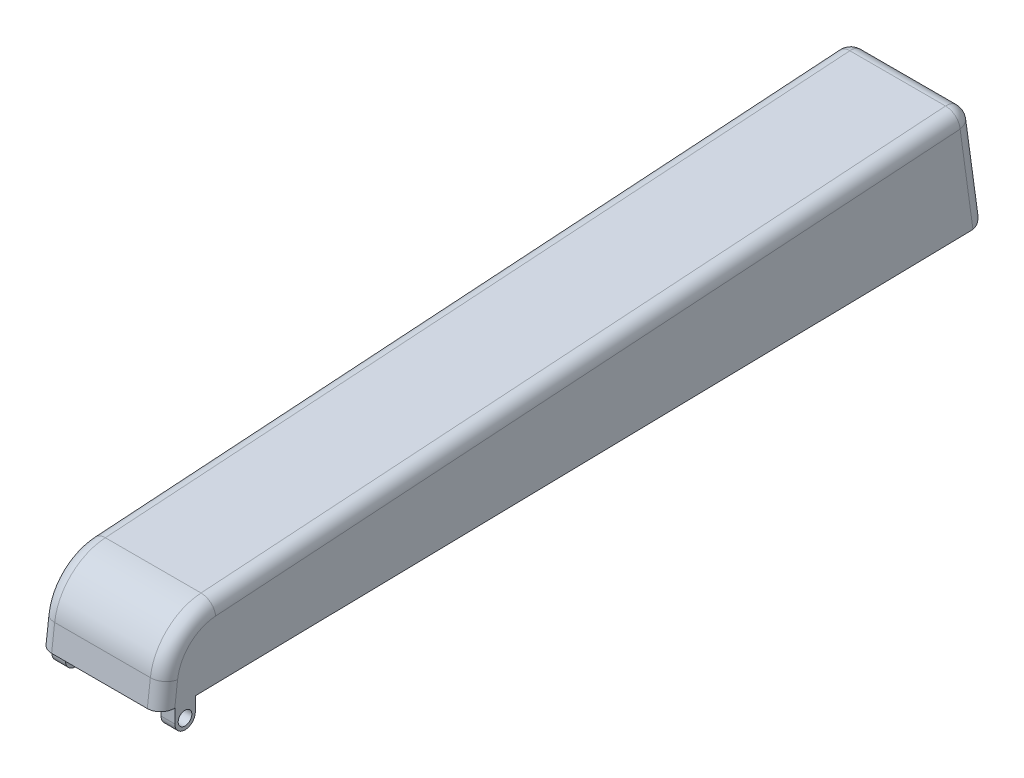
ISO-10303-21;
HEADER;
FILE_DESCRIPTION(('STEP AP214'),'2;1');
FILE_NAME('part.step','',(''),(''),'','','');
FILE_SCHEMA(('AUTOMOTIVE_DESIGN { 1 0 10303 214 1 1 1 1 }'));
ENDSEC;
DATA;
#1=APPLICATION_CONTEXT('core data for automotive mechanical design processes');
#2=APPLICATION_PROTOCOL_DEFINITION('international standard','automotive_design',2000,#1);
#3=PRODUCT_CONTEXT('',#1,'mechanical');
#4=PRODUCT('Part','Part','',(#3));
#5=PRODUCT_RELATED_PRODUCT_CATEGORY('part','',(#4));
#6=PRODUCT_DEFINITION_FORMATION('','',#4);
#7=PRODUCT_DEFINITION_CONTEXT('part definition',#1,'design');
#8=PRODUCT_DEFINITION('design','',#6,#7);
#9=PRODUCT_DEFINITION_SHAPE('','',#8);
#10=(LENGTH_UNIT() NAMED_UNIT(*) SI_UNIT(.MILLI.,.METRE.));
#11=(NAMED_UNIT(*) PLANE_ANGLE_UNIT() SI_UNIT($,.RADIAN.));
#12=(NAMED_UNIT(*) SI_UNIT($,.STERADIAN.) SOLID_ANGLE_UNIT());
#13=UNCERTAINTY_MEASURE_WITH_UNIT(LENGTH_MEASURE(1.E-05),#10,'distance_accuracy_value','');
#14=(GEOMETRIC_REPRESENTATION_CONTEXT(3) GLOBAL_UNCERTAINTY_ASSIGNED_CONTEXT((#13)) GLOBAL_UNIT_ASSIGNED_CONTEXT((#10,
#11,#12)) REPRESENTATION_CONTEXT('',''));
#15=CARTESIAN_POINT('',(0.,0.,0.));
#16=DIRECTION('',(0.,0.,1.));
#17=DIRECTION('',(1.,0.,0.));
#18=AXIS2_PLACEMENT_3D('',#15,#16,#17);
#19=CARTESIAN_POINT('',(22.8600000000001,-6.59720183053403,95.3996827995972));
#20=DIRECTION('',(0.,0.999811154580376,0.0194333521724517));
#21=DIRECTION('',(0.,-0.0194333521724517,0.999811154580376));
#22=AXIS2_PLACEMENT_3D('',#19,#20,#21);
#23=PLANE('',#22);
#24=DIRECTION('',(0.,0.0194333521724517,-0.999811154580376));
#25=VECTOR('',#24,1.);
#26=CARTESIAN_POINT('',(0.,-6.59720183053403,95.3996827995972));
#27=LINE('',#26,#25);
#28=CARTESIAN_POINT('',(0.,-6.473302977134,89.0253087559675));
#29=VERTEX_POINT('',#28);
#30=CARTESIAN_POINT('',(0.,-3.67064326639599,-55.1665124194799));
#31=VERTEX_POINT('',#30);
#32=EDGE_CURVE('E390',#29,#31,#27,.T.);
#33=ORIENTED_EDGE('',*,*,#32,.T.);
#34=DIRECTION('',(-1.,0.,0.));
#35=VECTOR('',#34,1.);
#36=CARTESIAN_POINT('',(22.8600000000001,-3.67064326639599,-55.1665124194799));
#37=LINE('',#36,#35);
#38=CARTESIAN_POINT('',(2.53999999999999,-3.67064326639599,-55.16651241948));
#39=VERTEX_POINT('',#38);
#40=EDGE_CURVE('E452',#31,#39,#37,.F.);
#41=ORIENTED_EDGE('',*,*,#40,.T.);
#42=DIRECTION('',(0.,0.0194333521724517,-0.999811154580376));
#43=VECTOR('',#42,1.);
#44=CARTESIAN_POINT('',(2.53999999999999,-6.59720183053403,95.3996827995972));
#45=LINE('',#44,#43);
#46=CARTESIAN_POINT('',(2.53999999999999,-6.473302977134,89.0253087559675));
#47=VERTEX_POINT('',#46);
#48=EDGE_CURVE('E361',#47,#39,#45,.T.);
#49=ORIENTED_EDGE('',*,*,#48,.F.);
#50=DIRECTION('',(-1.,0.,0.));
#51=VECTOR('',#50,1.);
#52=CARTESIAN_POINT('',(2.53999999999999,-6.473302977134,89.0253087559675));
#53=LINE('',#52,#51);
#54=EDGE_CURVE('E298',#47,#29,#53,.T.);
#55=ORIENTED_EDGE('',*,*,#54,.T.);
#56=EDGE_LOOP('',(#33,#41,#49,#55));
#57=FACE_BOUND('',#56,.T.);
#58=ADVANCED_FACE('F129',(#57),#23,.F.);
#59=DIRECTION('',(0.,0.0194333521724517,-0.999811154580376));
#60=VECTOR('',#59,1.);
#61=CARTESIAN_POINT('',(20.3199999999999,-6.59720183053403,95.3996827995972));
#62=LINE('',#61,#60);
#63=CARTESIAN_POINT('',(20.3199999999999,-6.473302977134,89.0253087559675));
#64=VERTEX_POINT('',#63);
#65=CARTESIAN_POINT('',(20.3199999999999,-3.67064326639599,-55.16651241948));
#66=VERTEX_POINT('',#65);
#67=EDGE_CURVE('E365',#64,#66,#62,.T.);
#68=ORIENTED_EDGE('',*,*,#67,.T.);
#69=DIRECTION('',(-1.,0.,0.));
#70=VECTOR('',#69,1.);
#71=CARTESIAN_POINT('',(22.8600000000001,-3.67064326639599,-55.1665124194799));
#72=LINE('',#71,#70);
#73=CARTESIAN_POINT('',(22.8600000000001,-3.67064326639599,-55.1665124194799));
#74=VERTEX_POINT('',#73);
#75=EDGE_CURVE('E450',#66,#74,#72,.F.);
#76=ORIENTED_EDGE('',*,*,#75,.T.);
#77=DIRECTION('',(0.,0.0194333521724517,-0.999811154580376));
#78=VECTOR('',#77,1.);
#79=CARTESIAN_POINT('',(22.8600000000001,-6.59720183053403,95.3996827995972));
#80=LINE('',#79,#78);
#81=CARTESIAN_POINT('',(22.8600000000001,-6.473302977134,89.0253087559675));
#82=VERTEX_POINT('',#81);
#83=EDGE_CURVE('E394',#82,#74,#80,.T.);
#84=ORIENTED_EDGE('',*,*,#83,.F.);
#85=DIRECTION('',(1.,0.,0.));
#86=VECTOR('',#85,1.);
#87=CARTESIAN_POINT('',(20.3199999999999,-6.473302977134,89.0253087559675));
#88=LINE('',#87,#86);
#89=EDGE_CURVE('E347',#64,#82,#88,.T.);
#90=ORIENTED_EDGE('',*,*,#89,.F.);
#91=EDGE_LOOP('',(#68,#76,#84,#90));
#92=FACE_BOUND('',#91,.T.);
#93=ADVANCED_FACE('F537',(#92),#23,.F.);
#94=DIRECTION('',(1.,0.,0.));
#95=VECTOR('',#94,1.);
#96=CARTESIAN_POINT('',(20.3199999999999,-6.5473580338693,92.8353087559676));
#97=LINE('',#96,#95);
#98=CARTESIAN_POINT('',(20.3199999999999,-6.5473580338693,92.8353087559676));
#99=VERTEX_POINT('',#98);
#100=CARTESIAN_POINT('',(22.8600000000001,-6.5473580338693,92.8353087559676));
#101=VERTEX_POINT('',#100);
#102=EDGE_CURVE('E344',#99,#101,#97,.T.);
#103=ORIENTED_EDGE('',*,*,#102,.T.);
#104=CARTESIAN_POINT('',(20.3199999999999,-6.5473580338693,92.8353087559676));
#105=DIRECTION('',(0.,0.999811154580376,0.0194333521724517));
#106=DIRECTION('',(0.,0.0194333521724517,-0.999811154580376));
#107=AXIS2_PLACEMENT_3D('',#104,#105,#106);
#108=ELLIPSE('',#107,2.5648584053917,2.54);
#109=CARTESIAN_POINT('',(20.3199999999999,-6.59720183053403,95.3996827995972));
#110=VERTEX_POINT('',#109);
#111=EDGE_CURVE('E421',#101,#110,#108,.F.);
#112=ORIENTED_EDGE('',*,*,#111,.T.);
#113=DIRECTION('',(-1.,0.,0.));
#114=VECTOR('',#113,1.);
#115=CARTESIAN_POINT('',(22.8600000000001,-6.59720183053403,95.3996827995972));
#116=LINE('',#115,#114);
#117=CARTESIAN_POINT('',(2.53999999999999,-6.59720183053403,95.3996827995972));
#118=VERTEX_POINT('',#117);
#119=EDGE_CURVE('E405',#110,#118,#116,.T.);
#120=ORIENTED_EDGE('',*,*,#119,.T.);
#121=CARTESIAN_POINT('',(2.53999999999999,-6.5473580338693,92.8353087559676));
#122=DIRECTION('',(0.,0.999811154580376,0.0194333521724517));
#123=DIRECTION('',(0.,-0.0194333521724517,0.999811154580376));
#124=AXIS2_PLACEMENT_3D('',#121,#122,#123);
#125=ELLIPSE('',#124,2.5648584053917,2.54);
#126=CARTESIAN_POINT('',(0.,-6.5473580338693,92.8353087559676));
#127=VERTEX_POINT('',#126);
#128=EDGE_CURVE('E419',#118,#127,#125,.F.);
#129=ORIENTED_EDGE('',*,*,#128,.T.);
#130=DIRECTION('',(-1.,0.,0.));
#131=VECTOR('',#130,1.);
#132=CARTESIAN_POINT('',(2.53999999999999,-6.5473580338693,92.8353087559676));
#133=LINE('',#132,#131);
#134=CARTESIAN_POINT('',(2.53999999999999,-6.5473580338693,92.8353087559676));
#135=VERTEX_POINT('',#134);
#136=EDGE_CURVE('E316',#135,#127,#133,.T.);
#137=ORIENTED_EDGE('',*,*,#136,.F.);
#138=DIRECTION('',(-1.,0.,0.));
#139=VECTOR('',#138,1.);
#140=CARTESIAN_POINT('',(22.8600000000001,-6.5473580338693,92.8353087559676));
#141=LINE('',#140,#139);
#142=EDGE_CURVE('E385',#99,#135,#141,.T.);
#143=ORIENTED_EDGE('',*,*,#142,.F.);
#144=EDGE_LOOP('',(#103,#112,#120,#129,#137,#143));
#145=FACE_BOUND('',#144,.T.);
#146=ADVANCED_FACE('F540',(#145),#23,.F.);
#147=CARTESIAN_POINT('',(22.8600000000001,-6.59720183053403,95.3996827995972));
#148=DIRECTION('',(0.,-0.119616882578494,-0.992820125401478));
#149=DIRECTION('',(0.,0.992820125401478,-0.119616882578494));
#150=AXIS2_PLACEMENT_3D('',#147,#148,#149);
#151=PLANE('',#150);
#152=ORIENTED_EDGE('',*,*,#119,.F.);
#153=DIRECTION('',(0.,-0.992820125401478,0.119616882578494));
#154=VECTOR('',#153,1.);
#155=CARTESIAN_POINT('',(20.3199999999999,-1.90666590364641,94.8345579891291));
#156=LINE('',#155,#154);
#157=CARTESIAN_POINT('',(20.3199999999999,-1.90666590364641,94.8345579891291));
#158=VERTEX_POINT('',#157);
#159=EDGE_CURVE('E425',#110,#158,#156,.F.);
#160=ORIENTED_EDGE('',*,*,#159,.T.);
#161=DIRECTION('',(-1.,0.,0.));
#162=VECTOR('',#161,1.);
#163=CARTESIAN_POINT('',(22.8600000000001,-1.90666590364641,94.8345579891291));
#164=LINE('',#163,#162);
#165=CARTESIAN_POINT('',(2.53999999999999,-1.90666590364641,94.8345579891291));
#166=VERTEX_POINT('',#165);
#167=EDGE_CURVE('E397',#158,#166,#164,.T.);
#168=ORIENTED_EDGE('',*,*,#167,.T.);
#169=DIRECTION('',(0.,-0.992820125401478,0.119616882578494));
#170=VECTOR('',#169,1.);
#171=CARTESIAN_POINT('',(2.53999999999999,-6.59720183053403,95.3996827995972));
#172=LINE('',#171,#170);
#173=EDGE_CURVE('E423',#166,#118,#172,.T.);
#174=ORIENTED_EDGE('',*,*,#173,.T.);
#175=EDGE_LOOP('',(#152,#160,#168,#174));
#176=FACE_BOUND('',#175,.T.);
#177=ADVANCED_FACE('F551',(#176),#151,.F.);
#178=CARTESIAN_POINT('',(22.8600000000001,-3.61512807447695,-58.0226695886644));
#179=DIRECTION('',(0.,-0.1362419322973,0.990675595684027));
#180=DIRECTION('',(0.,-0.990675595684027,-0.1362419322973));
#181=AXIS2_PLACEMENT_3D('',#178,#179,#180);
#182=PLANE('',#181);
#183=DIRECTION('',(0.,0.990675595684027,0.1362419322973));
#184=VECTOR('',#183,1.);
#185=CARTESIAN_POINT('',(20.3199999999999,-3.61512807447695,-58.0226695886644));
#186=LINE('',#185,#184);
#187=CARTESIAN_POINT('',(20.3199999999999,14.0203810294459,-55.5973591764236));
#188=VERTEX_POINT('',#187);
#189=CARTESIAN_POINT('',(20.3199999999999,-0.78506842572601,-57.6334677179988));
#190=VERTEX_POINT('',#189);
#191=EDGE_CURVE('E445',#188,#190,#186,.F.);
#192=ORIENTED_EDGE('',*,*,#191,.T.);
#193=DIRECTION('',(-1.,0.,0.));
#194=VECTOR('',#193,1.);
#195=CARTESIAN_POINT('',(22.8600000000001,-0.78506842572601,-57.6334677179988));
#196=LINE('',#195,#194);
#197=CARTESIAN_POINT('',(2.53999999999999,-0.78506842572601,-57.6334677179988));
#198=VERTEX_POINT('',#197);
#199=EDGE_CURVE('E447',#190,#198,#196,.T.);
#200=ORIENTED_EDGE('',*,*,#199,.T.);
#201=DIRECTION('',(0.,0.990675595684027,0.1362419322973));
#202=VECTOR('',#201,1.);
#203=CARTESIAN_POINT('',(2.53999999999999,-3.61512807447695,-58.0226695886644));
#204=LINE('',#203,#202);
#205=CARTESIAN_POINT('',(2.53999999999999,14.0203810294459,-55.5973591764236));
#206=VERTEX_POINT('',#205);
#207=EDGE_CURVE('E443',#198,#206,#204,.T.);
#208=ORIENTED_EDGE('',*,*,#207,.T.);
#209=DIRECTION('',(-1.,0.,0.));
#210=VECTOR('',#209,1.);
#211=CARTESIAN_POINT('',(22.8600000000001,14.0203810294459,-55.5973591764236));
#212=LINE('',#211,#210);
#213=EDGE_CURVE('E441',#206,#188,#212,.F.);
#214=ORIENTED_EDGE('',*,*,#213,.T.);
#215=EDGE_LOOP('',(#192,#200,#208,#214));
#216=FACE_BOUND('',#215,.T.);
#217=ADVANCED_FACE('F557',(#216),#182,.F.);
#218=CARTESIAN_POINT('',(22.8600000000001,7.01566550149191,85.421209368135));
#219=DIRECTION('',(0.,-0.9977991074936,-0.0663094343587519));
#220=DIRECTION('',(0.,0.066309434358752,-0.997799107493601));
#221=AXIS2_PLACEMENT_3D('',#218,#219,#220);
#222=PLANE('',#221);
#223=DIRECTION('',(-1.,0.,0.));
#224=VECTOR('',#223,1.);
#225=CARTESIAN_POINT('',(22.8600000000001,7.01566550149191,85.421209368135));
#226=LINE('',#225,#224);
#227=CARTESIAN_POINT('',(20.3199999999999,7.01566550149191,85.421209368135));
#228=VERTEX_POINT('',#227);
#229=CARTESIAN_POINT('',(2.53999999999999,7.01566550149191,85.421209368135));
#230=VERTEX_POINT('',#229);
#231=EDGE_CURVE('E402',#228,#230,#226,.T.);
#232=ORIENTED_EDGE('',*,*,#231,.F.);
#233=DIRECTION('',(0.,-0.066309434358752,0.997799107493601));
#234=VECTOR('',#233,1.);
#235=CARTESIAN_POINT('',(20.3199999999999,16.365717982268,-55.2748184378279));
#236=LINE('',#235,#234);
#237=CARTESIAN_POINT('',(20.3199999999999,16.2087362544445,-52.9126172001146));
#238=VERTEX_POINT('',#237);
#239=EDGE_CURVE('E14',#228,#238,#236,.F.);
#240=ORIENTED_EDGE('',*,*,#239,.T.);
#241=DIRECTION('',(-1.,0.,0.));
#242=VECTOR('',#241,1.);
#243=CARTESIAN_POINT('',(22.8600000000001,16.2087362544445,-52.9126172001146));
#244=LINE('',#243,#242);
#245=CARTESIAN_POINT('',(2.53999999999999,16.2087362544445,-52.9126172001146));
#246=VERTEX_POINT('',#245);
#247=EDGE_CURVE('E138',#238,#246,#244,.T.);
#248=ORIENTED_EDGE('',*,*,#247,.T.);
#249=DIRECTION('',(0.,-0.066309434358752,0.997799107493601));
#250=VECTOR('',#249,1.);
#251=CARTESIAN_POINT('',(2.53999999999999,7.01566550149191,85.421209368135));
#252=LINE('',#251,#250);
#253=EDGE_CURVE('E460',#246,#230,#252,.T.);
#254=ORIENTED_EDGE('',*,*,#253,.T.);
#255=EDGE_LOOP('',(#232,#240,#248,#254));
#256=FACE_BOUND('',#255,.T.);
#257=ADVANCED_FACE('F633',(#256),#222,.F.);
#258=CARTESIAN_POINT('',(22.8600000000001,-3.1219734306438,84.74750551505));
#259=DIRECTION('',(-1.,0.,0.));
#260=DIRECTION('',(0.,0.,1.));
#261=AXIS2_PLACEMENT_3D('',#258,#259,#260);
#262=CYLINDRICAL_SURFACE('',#261,10.16);
#263=ORIENTED_EDGE('',*,*,#167,.F.);
#264=CARTESIAN_POINT('',(20.3199999999999,-3.1219734306438,84.74750551505));
#265=DIRECTION('',(1.,0.,0.));
#266=DIRECTION('',(0.,0.,-1.));
#267=AXIS2_PLACEMENT_3D('',#264,#265,#266);
#268=CIRCLE('',#267,10.16);
#269=EDGE_CURVE('E429',#158,#228,#268,.F.);
#270=ORIENTED_EDGE('',*,*,#269,.T.);
#271=ORIENTED_EDGE('',*,*,#231,.T.);
#272=CARTESIAN_POINT('',(2.53999999999999,-3.1219734306438,84.74750551505));
#273=DIRECTION('',(1.,0.,0.));
#274=DIRECTION('',(0.,0.,-1.));
#275=AXIS2_PLACEMENT_3D('',#272,#273,#274);
#276=CIRCLE('',#275,10.16);
#277=EDGE_CURVE('E427',#230,#166,#276,.T.);
#278=ORIENTED_EDGE('',*,*,#277,.T.);
#279=EDGE_LOOP('',(#263,#270,#271,#278));
#280=FACE_BOUND('',#279,.T.);
#281=ADVANCED_FACE('F612',(#280),#262,.T.);
#282=CARTESIAN_POINT('',(22.8600000000001,-3.1219734306438,84.74750551505));
#283=DIRECTION('',(1.,0.,0.));
#284=DIRECTION('',(0.,0.,-1.));
#285=AXIS2_PLACEMENT_3D('',#282,#283,#284);
#286=PLANE('',#285);
#287=CARTESIAN_POINT('',(22.8600000000001,-3.1219734306438,84.74750551505));
#288=DIRECTION('',(1.,0.,0.));
#289=DIRECTION('',(0.,0.,-1.));
#290=AXIS2_PLACEMENT_3D('',#287,#288,#289);
#291=CIRCLE('',#290,7.61999999999999);
#292=CARTESIAN_POINT('',(22.8600000000001,4.48125576845726,85.2527834048634));
#293=VERTEX_POINT('',#292);
#294=CARTESIAN_POINT('',(22.8600000000001,-2.21049278539565,92.3127948706092));
#295=VERTEX_POINT('',#294);
#296=EDGE_CURVE('E414',#293,#295,#291,.T.);
#297=ORIENTED_EDGE('',*,*,#296,.T.);
#298=DIRECTION('',(0.,-0.992820125401478,0.119616882578494));
#299=VECTOR('',#298,1.);
#300=CARTESIAN_POINT('',(22.8600000000001,-6.90102871228337,92.8779196810778));
#301=LINE('',#300,#299);
#302=EDGE_CURVE('E416',#295,#101,#301,.T.);
#303=ORIENTED_EDGE('',*,*,#302,.T.);
#304=DIRECTION('',(0.,-1.,0.));
#305=VECTOR('',#304,1.);
#306=CARTESIAN_POINT('',(22.8600000000001,0.,92.8353087559673));
#307=LINE('',#306,#305);
#308=CARTESIAN_POINT('',(22.8600000000001,-9.08735803386906,92.8353087559676));
#309=VERTEX_POINT('',#308);
#310=EDGE_CURVE('E331',#101,#309,#307,.T.);
#311=ORIENTED_EDGE('',*,*,#310,.T.);
#312=CARTESIAN_POINT('',(22.8600000000001,-9.08735803387017,90.9303087559671));
#313=DIRECTION('',(1.,0.,0.));
#314=DIRECTION('',(0.,0.,-1.));
#315=AXIS2_PLACEMENT_3D('',#312,#313,#314);
#316=CIRCLE('',#315,1.90499999999999);
#317=CARTESIAN_POINT('',(22.8600000000001,-9.0873580338704,89.0253087559675));
#318=VERTEX_POINT('',#317);
#319=EDGE_CURVE('E353',#309,#318,#316,.T.);
#320=ORIENTED_EDGE('',*,*,#319,.T.);
#321=DIRECTION('',(0.,1.,0.));
#322=VECTOR('',#321,1.);
#323=CARTESIAN_POINT('',(22.8600000000001,0.,89.0253087559677));
#324=LINE('',#323,#322);
#325=EDGE_CURVE('E335',#318,#82,#324,.T.);
#326=ORIENTED_EDGE('',*,*,#325,.T.);
#327=ORIENTED_EDGE('',*,*,#83,.T.);
#328=CARTESIAN_POINT('',(22.8600000000001,-1.13112293376094,-55.1171517049619));
#329=DIRECTION('',(1.,0.,0.));
#330=DIRECTION('',(0.,0.,-1.));
#331=AXIS2_PLACEMENT_3D('',#328,#329,#330);
#332=CIRCLE('',#331,2.54);
#333=CARTESIAN_POINT('',(22.8600000000001,-3.64743894679842,-55.4632062129968));
#334=VERTEX_POINT('',#333);
#335=EDGE_CURVE('E412',#74,#334,#332,.T.);
#336=ORIENTED_EDGE('',*,*,#335,.T.);
#337=DIRECTION('',(0.,0.990675595684027,0.1362419322973));
#338=VECTOR('',#337,1.);
#339=CARTESIAN_POINT('',(22.8600000000001,16.0196634742331,-52.7585024247907));
#340=LINE('',#339,#338);
#341=CARTESIAN_POINT('',(22.8600000000001,13.6743265214108,-53.0810431633864));
#342=VERTEX_POINT('',#341);
#343=EDGE_CURVE('E410',#334,#342,#340,.T.);
#344=ORIENTED_EDGE('',*,*,#343,.T.);
#345=DIRECTION('',(0.,-0.066309434358752,0.997799107493601));
#346=VECTOR('',#345,1.);
#347=CARTESIAN_POINT('',(22.8600000000001,4.48125576845726,85.2527834048634));
#348=LINE('',#347,#346);
#349=EDGE_CURVE('E408',#342,#293,#348,.T.);
#350=ORIENTED_EDGE('',*,*,#349,.T.);
#351=EDGE_LOOP('',(#297,#303,#311,#320,#326,#327,#336,#344,#350));
#352=FACE_BOUND('',#351,.T.);
#353=CARTESIAN_POINT('',(22.8600000000001,-9.08735803387017,90.9303087559671));
#354=DIRECTION('',(1.,0.,0.));
#355=DIRECTION('',(0.,0.,-1.));
#356=AXIS2_PLACEMENT_3D('',#353,#354,#355);
#357=CIRCLE('',#356,1.26999999999999);
#358=CARTESIAN_POINT('',(22.8600000000001,-9.08735803387017,89.6603087559671));
#359=VERTEX_POINT('',#358);
#360=EDGE_CURVE('E297',#359,#359,#357,.T.);
#361=ORIENTED_EDGE('',*,*,#360,.F.);
#362=EDGE_LOOP('',(#361));
#363=FACE_BOUND('',#362,.T.);
#364=ADVANCED_FACE('F599',(#352,#363),#286,.T.);
#365=CARTESIAN_POINT('',(0.,-3.1219734306438,84.74750551505));
#366=DIRECTION('',(1.,0.,0.));
#367=DIRECTION('',(0.,0.,-1.));
#368=AXIS2_PLACEMENT_3D('',#365,#366,#367);
#369=PLANE('',#368);
#370=DIRECTION('',(0.,-1.,0.));
#371=VECTOR('',#370,1.);
#372=CARTESIAN_POINT('',(0.,0.,92.8353087559673));
#373=LINE('',#372,#371);
#374=CARTESIAN_POINT('',(0.,-9.08735803386906,92.8353087559676));
#375=VERTEX_POINT('',#374);
#376=EDGE_CURVE('E310',#127,#375,#373,.T.);
#377=ORIENTED_EDGE('',*,*,#376,.F.);
#378=DIRECTION('',(0.,-0.992820125401478,0.119616882578494));
#379=VECTOR('',#378,1.);
#380=CARTESIAN_POINT('',(0.,-2.2104927853952,92.3127948706092));
#381=LINE('',#380,#379);
#382=CARTESIAN_POINT('',(0.,-2.21049278539565,92.3127948706092));
#383=VERTEX_POINT('',#382);
#384=EDGE_CURVE('E439',#127,#383,#381,.F.);
#385=ORIENTED_EDGE('',*,*,#384,.T.);
#386=CARTESIAN_POINT('',(0.,-3.1219734306438,84.74750551505));
#387=DIRECTION('',(1.,0.,0.));
#388=DIRECTION('',(0.,0.,-1.));
#389=AXIS2_PLACEMENT_3D('',#386,#387,#388);
#390=CIRCLE('',#389,7.61999999999999);
#391=CARTESIAN_POINT('',(0.,4.48125576845726,85.2527834048634));
#392=VERTEX_POINT('',#391);
#393=EDGE_CURVE('E437',#383,#392,#390,.F.);
#394=ORIENTED_EDGE('',*,*,#393,.T.);
#395=DIRECTION('',(0.,-0.066309434358752,0.997799107493601));
#396=VECTOR('',#395,1.);
#397=CARTESIAN_POINT('',(0.,4.48125576845726,85.2527834048634));
#398=LINE('',#397,#396);
#399=CARTESIAN_POINT('',(0.,13.6743265214108,-53.0810431633864));
#400=VERTEX_POINT('',#399);
#401=EDGE_CURVE('E431',#392,#400,#398,.F.);
#402=ORIENTED_EDGE('',*,*,#401,.T.);
#403=DIRECTION('',(0.,0.990675595684027,0.1362419322973));
#404=VECTOR('',#403,1.);
#405=CARTESIAN_POINT('',(0.,15.7927310809609,-52.7897111351847));
#406=LINE('',#405,#404);
#407=CARTESIAN_POINT('',(0.,-3.64743894679842,-55.4632062129968));
#408=VERTEX_POINT('',#407);
#409=EDGE_CURVE('E433',#400,#408,#406,.F.);
#410=ORIENTED_EDGE('',*,*,#409,.T.);
#411=CARTESIAN_POINT('',(0.,-1.13112293376094,-55.1171517049619));
#412=DIRECTION('',(1.,0.,0.));
#413=DIRECTION('',(0.,0.,-1.));
#414=AXIS2_PLACEMENT_3D('',#411,#412,#413);
#415=CIRCLE('',#414,2.54);
#416=EDGE_CURVE('E435',#408,#31,#415,.F.);
#417=ORIENTED_EDGE('',*,*,#416,.T.);
#418=ORIENTED_EDGE('',*,*,#32,.F.);
#419=DIRECTION('',(0.,1.,0.));
#420=VECTOR('',#419,1.);
#421=CARTESIAN_POINT('',(0.,0.,89.0253087559677));
#422=LINE('',#421,#420);
#423=CARTESIAN_POINT('',(0.,-9.0873580338704,89.0253087559675));
#424=VERTEX_POINT('',#423);
#425=EDGE_CURVE('E318',#424,#29,#422,.T.);
#426=ORIENTED_EDGE('',*,*,#425,.F.);
#427=CARTESIAN_POINT('',(0.,-9.08735803387017,90.9303087559671));
#428=DIRECTION('',(1.,0.,0.));
#429=DIRECTION('',(0.,0.,-1.));
#430=AXIS2_PLACEMENT_3D('',#427,#428,#429);
#431=CIRCLE('',#430,1.90499999999999);
#432=EDGE_CURVE('E293',#375,#424,#431,.T.);
#433=ORIENTED_EDGE('',*,*,#432,.F.);
#434=EDGE_LOOP('',(#377,#385,#394,#402,#410,#417,#418,#426,#433));
#435=FACE_BOUND('',#434,.T.);
#436=CARTESIAN_POINT('',(0.,-9.08735803387017,90.9303087559671));
#437=DIRECTION('',(1.,0.,0.));
#438=DIRECTION('',(0.,0.,-1.));
#439=AXIS2_PLACEMENT_3D('',#436,#437,#438);
#440=CIRCLE('',#439,1.26999999999999);
#441=CARTESIAN_POINT('',(0.,-9.08735803387017,89.6603087559671));
#442=VERTEX_POINT('',#441);
#443=EDGE_CURVE('E497',#442,#442,#440,.T.);
#444=ORIENTED_EDGE('',*,*,#443,.T.);
#445=EDGE_LOOP('',(#444));
#446=FACE_BOUND('',#445,.T.);
#447=ADVANCED_FACE('F637',(#435,#446),#369,.F.);
#448=CARTESIAN_POINT('',(22.8600000000001,-6.90102871228337,92.8779196810778));
#449=DIRECTION('',(0.,-0.119616882578494,-0.992820125401478));
#450=DIRECTION('',(0.,0.992820125401478,-0.119616882578494));
#451=AXIS2_PLACEMENT_3D('',#448,#449,#450);
#452=PLANE('',#451);
#453=DIRECTION('',(0.,-0.992820125401478,0.119616882578494));
#454=VECTOR('',#453,1.);
#455=CARTESIAN_POINT('',(2.53999999999999,-6.90102871228337,92.8779196810778));
#456=LINE('',#455,#454);
#457=CARTESIAN_POINT('',(2.53999999999999,-2.21049278539565,92.3127948706092));
#458=VERTEX_POINT('',#457);
#459=EDGE_CURVE('E343',#458,#135,#456,.T.);
#460=ORIENTED_EDGE('',*,*,#459,.F.);
#461=DIRECTION('',(1.,0.,0.));
#462=VECTOR('',#461,1.);
#463=CARTESIAN_POINT('',(22.8600000000001,-2.21049278539565,92.3127948706092));
#464=LINE('',#463,#462);
#465=CARTESIAN_POINT('',(20.3199999999999,-2.21049278539565,92.3127948706092));
#466=VERTEX_POINT('',#465);
#467=EDGE_CURVE('E367',#466,#458,#464,.F.);
#468=ORIENTED_EDGE('',*,*,#467,.F.);
#469=DIRECTION('',(0.,-0.992820125401478,0.119616882578494));
#470=VECTOR('',#469,1.);
#471=CARTESIAN_POINT('',(20.3199999999999,-6.90102871228337,92.8779196810778));
#472=LINE('',#471,#470);
#473=EDGE_CURVE('E362',#466,#99,#472,.T.);
#474=ORIENTED_EDGE('',*,*,#473,.T.);
#475=ORIENTED_EDGE('',*,*,#142,.T.);
#476=EDGE_LOOP('',(#460,#468,#474,#475));
#477=FACE_BOUND('',#476,.T.);
#478=ADVANCED_FACE('F573',(#477),#452,.T.);
#479=CARTESIAN_POINT('',(22.8600000000001,-3.96118258251299,-55.5063535756269));
#480=DIRECTION('',(0.,-0.1362419322973,0.990675595684027));
#481=DIRECTION('',(0.,-0.990675595684027,-0.1362419322973));
#482=AXIS2_PLACEMENT_3D('',#479,#480,#481);
#483=PLANE('',#482);
#484=DIRECTION('',(0.,0.990675595684027,0.1362419322973));
#485=VECTOR('',#484,1.);
#486=CARTESIAN_POINT('',(2.53999999999999,-3.96118258251299,-55.5063535756269));
#487=LINE('',#486,#485);
#488=CARTESIAN_POINT('',(2.53999999999999,-3.64743894679842,-55.4632062129968));
#489=VERTEX_POINT('',#488);
#490=CARTESIAN_POINT('',(2.53999999999999,13.6743265214108,-53.0810431633864));
#491=VERTEX_POINT('',#490);
#492=EDGE_CURVE('E380',#489,#491,#487,.T.);
#493=ORIENTED_EDGE('',*,*,#492,.F.);
#494=DIRECTION('',(-1.,0.,0.));
#495=VECTOR('',#494,1.);
#496=CARTESIAN_POINT('',(2.53999999999999,-3.64743894679842,-55.4632062129968));
#497=LINE('',#496,#495);
#498=CARTESIAN_POINT('',(20.3199999999999,-3.64743894679842,-55.4632062129968));
#499=VERTEX_POINT('',#498);
#500=EDGE_CURVE('E456',#489,#499,#497,.F.);
#501=ORIENTED_EDGE('',*,*,#500,.T.);
#502=DIRECTION('',(0.,0.990675595684027,0.1362419322973));
#503=VECTOR('',#502,1.);
#504=CARTESIAN_POINT('',(20.3199999999999,-3.96118258251299,-55.5063535756269));
#505=LINE('',#504,#503);
#506=CARTESIAN_POINT('',(20.3199999999999,13.6743265214108,-53.0810431633864));
#507=VERTEX_POINT('',#506);
#508=EDGE_CURVE('E382',#499,#507,#505,.T.);
#509=ORIENTED_EDGE('',*,*,#508,.T.);
#510=DIRECTION('',(-1.,0.,0.));
#511=VECTOR('',#510,1.);
#512=CARTESIAN_POINT('',(22.8600000000001,13.6743265214108,-53.0810431633864));
#513=LINE('',#512,#511);
#514=EDGE_CURVE('E378',#507,#491,#513,.T.);
#515=ORIENTED_EDGE('',*,*,#514,.T.);
#516=EDGE_LOOP('',(#493,#501,#509,#515));
#517=FACE_BOUND('',#516,.T.);
#518=ADVANCED_FACE('F585',(#517),#483,.T.);
#519=CARTESIAN_POINT('',(22.8600000000001,4.48125576845726,85.2527834048634));
#520=DIRECTION('',(0.,-0.9977991074936,-0.0663094343587519));
#521=DIRECTION('',(0.,0.066309434358752,-0.997799107493601));
#522=AXIS2_PLACEMENT_3D('',#519,#520,#521);
#523=PLANE('',#522);
#524=DIRECTION('',(0.,-0.066309434358752,0.997799107493601));
#525=VECTOR('',#524,1.);
#526=CARTESIAN_POINT('',(2.53999999999999,4.48125576845726,85.2527834048634));
#527=LINE('',#526,#525);
#528=CARTESIAN_POINT('',(2.53999999999999,4.48125576845726,85.2527834048634));
#529=VERTEX_POINT('',#528);
#530=EDGE_CURVE('E373',#491,#529,#527,.T.);
#531=ORIENTED_EDGE('',*,*,#530,.F.);
#532=ORIENTED_EDGE('',*,*,#514,.F.);
#533=DIRECTION('',(0.,-0.066309434358752,0.997799107493601));
#534=VECTOR('',#533,1.);
#535=CARTESIAN_POINT('',(20.3199999999999,4.48125576845726,85.2527834048634));
#536=LINE('',#535,#534);
#537=CARTESIAN_POINT('',(20.3199999999999,4.48125576845726,85.2527834048634));
#538=VERTEX_POINT('',#537);
#539=EDGE_CURVE('E375',#507,#538,#536,.T.);
#540=ORIENTED_EDGE('',*,*,#539,.T.);
#541=DIRECTION('',(-1.,0.,0.));
#542=VECTOR('',#541,1.);
#543=CARTESIAN_POINT('',(22.8600000000001,4.48125576845726,85.2527834048634));
#544=LINE('',#543,#542);
#545=EDGE_CURVE('E370',#538,#529,#544,.T.);
#546=ORIENTED_EDGE('',*,*,#545,.T.);
#547=EDGE_LOOP('',(#531,#532,#540,#546));
#548=FACE_BOUND('',#547,.T.);
#549=ADVANCED_FACE('F582',(#548),#523,.T.);
#550=CARTESIAN_POINT('',(22.8600000000001,-3.1219734306438,84.74750551505));
#551=DIRECTION('',(-1.,0.,0.));
#552=DIRECTION('',(0.,0.,1.));
#553=AXIS2_PLACEMENT_3D('',#550,#551,#552);
#554=CYLINDRICAL_SURFACE('',#553,7.61999999999999);
#555=CARTESIAN_POINT('',(2.53999999999999,-3.1219734306438,84.74750551505));
#556=DIRECTION('',(1.,0.,0.));
#557=DIRECTION('',(0.,0.,-1.));
#558=AXIS2_PLACEMENT_3D('',#555,#556,#557);
#559=CIRCLE('',#558,7.61999999999999);
#560=EDGE_CURVE('E366',#529,#458,#559,.T.);
#561=ORIENTED_EDGE('',*,*,#560,.F.);
#562=ORIENTED_EDGE('',*,*,#545,.F.);
#563=CARTESIAN_POINT('',(20.3199999999999,-3.1219734306438,84.74750551505));
#564=DIRECTION('',(1.,0.,0.));
#565=DIRECTION('',(0.,0.,-1.));
#566=AXIS2_PLACEMENT_3D('',#563,#564,#565);
#567=CIRCLE('',#566,7.61999999999999);
#568=EDGE_CURVE('E371',#538,#466,#567,.T.);
#569=ORIENTED_EDGE('',*,*,#568,.T.);
#570=ORIENTED_EDGE('',*,*,#467,.T.);
#571=EDGE_LOOP('',(#561,#562,#569,#570));
#572=FACE_BOUND('',#571,.T.);
#573=ADVANCED_FACE('F529',(#572),#554,.F.);
#574=CARTESIAN_POINT('',(20.3199999999999,-3.1219734306438,84.74750551505));
#575=DIRECTION('',(1.,0.,0.));
#576=DIRECTION('',(0.,0.,-1.));
#577=AXIS2_PLACEMENT_3D('',#574,#575,#576);
#578=PLANE('',#577);
#579=ORIENTED_EDGE('',*,*,#508,.F.);
#580=CARTESIAN_POINT('',(20.3199999999999,-1.13112293376094,-55.1171517049619));
#581=DIRECTION('',(1.,0.,0.));
#582=DIRECTION('',(0.,0.,-1.));
#583=AXIS2_PLACEMENT_3D('',#580,#581,#582);
#584=CIRCLE('',#583,2.54);
#585=EDGE_CURVE('E458',#499,#66,#584,.F.);
#586=ORIENTED_EDGE('',*,*,#585,.T.);
#587=ORIENTED_EDGE('',*,*,#67,.F.);
#588=DIRECTION('',(0.,1.,0.));
#589=VECTOR('',#588,1.);
#590=CARTESIAN_POINT('',(20.3199999999999,0.,89.0253087559677));
#591=LINE('',#590,#589);
#592=CARTESIAN_POINT('',(20.3199999999999,-9.0873580338704,89.0253087559675));
#593=VERTEX_POINT('',#592);
#594=EDGE_CURVE('E328',#593,#64,#591,.T.);
#595=ORIENTED_EDGE('',*,*,#594,.F.);
#596=CARTESIAN_POINT('',(20.3199999999999,-9.08735803387017,90.9303087559671));
#597=DIRECTION('',(1.,0.,0.));
#598=DIRECTION('',(0.,0.,-1.));
#599=AXIS2_PLACEMENT_3D('',#596,#597,#598);
#600=CIRCLE('',#599,1.90499999999999);
#601=CARTESIAN_POINT('',(20.3199999999999,-9.08735803386906,92.8353087559676));
#602=VERTEX_POINT('',#601);
#603=EDGE_CURVE('E338',#602,#593,#600,.T.);
#604=ORIENTED_EDGE('',*,*,#603,.F.);
#605=DIRECTION('',(0.,-1.,0.));
#606=VECTOR('',#605,1.);
#607=CARTESIAN_POINT('',(20.3199999999999,0.,92.8353087559673));
#608=LINE('',#607,#606);
#609=EDGE_CURVE('E330',#99,#602,#608,.T.);
#610=ORIENTED_EDGE('',*,*,#609,.F.);
#611=ORIENTED_EDGE('',*,*,#473,.F.);
#612=ORIENTED_EDGE('',*,*,#568,.F.);
#613=ORIENTED_EDGE('',*,*,#539,.F.);
#614=EDGE_LOOP('',(#579,#586,#587,#595,#604,#610,#611,#612,#613));
#615=FACE_BOUND('',#614,.T.);
#616=CARTESIAN_POINT('',(20.3199999999999,-9.08735803387017,90.9303087559671));
#617=DIRECTION('',(1.,0.,0.));
#618=DIRECTION('',(0.,0.,-1.));
#619=AXIS2_PLACEMENT_3D('',#616,#617,#618);
#620=CIRCLE('',#619,1.26999999999999);
#621=CARTESIAN_POINT('',(20.3199999999999,-9.08735803387017,89.6603087559671));
#622=VERTEX_POINT('',#621);
#623=EDGE_CURVE('E350',#622,#622,#620,.T.);
#624=ORIENTED_EDGE('',*,*,#623,.T.);
#625=EDGE_LOOP('',(#624));
#626=FACE_BOUND('',#625,.T.);
#627=ADVANCED_FACE('F515',(#615,#626),#578,.F.);
#628=CARTESIAN_POINT('',(2.53999999999999,-3.1219734306438,84.74750551505));
#629=DIRECTION('',(1.,0.,0.));
#630=DIRECTION('',(0.,0.,-1.));
#631=AXIS2_PLACEMENT_3D('',#628,#629,#630);
#632=PLANE('',#631);
#633=ORIENTED_EDGE('',*,*,#48,.T.);
#634=CARTESIAN_POINT('',(2.53999999999999,-1.13112293376094,-55.1171517049619));
#635=DIRECTION('',(1.,0.,0.));
#636=DIRECTION('',(0.,0.,-1.));
#637=AXIS2_PLACEMENT_3D('',#634,#635,#636);
#638=CIRCLE('',#637,2.54);
#639=EDGE_CURVE('E454',#39,#489,#638,.T.);
#640=ORIENTED_EDGE('',*,*,#639,.T.);
#641=ORIENTED_EDGE('',*,*,#492,.T.);
#642=ORIENTED_EDGE('',*,*,#530,.T.);
#643=ORIENTED_EDGE('',*,*,#560,.T.);
#644=ORIENTED_EDGE('',*,*,#459,.T.);
#645=DIRECTION('',(0.,-1.,0.));
#646=VECTOR('',#645,1.);
#647=CARTESIAN_POINT('',(2.53999999999999,0.,92.8353087559673));
#648=LINE('',#647,#646);
#649=CARTESIAN_POINT('',(2.53999999999999,-9.08735803386906,92.8353087559676));
#650=VERTEX_POINT('',#649);
#651=EDGE_CURVE('E308',#135,#650,#648,.T.);
#652=ORIENTED_EDGE('',*,*,#651,.T.);
#653=CARTESIAN_POINT('',(2.53999999999999,-9.08735803387017,90.9303087559671));
#654=DIRECTION('',(1.,0.,0.));
#655=DIRECTION('',(0.,0.,-1.));
#656=AXIS2_PLACEMENT_3D('',#653,#654,#655);
#657=CIRCLE('',#656,1.90499999999999);
#658=CARTESIAN_POINT('',(2.53999999999999,-9.0873580338704,89.0253087559675));
#659=VERTEX_POINT('',#658);
#660=EDGE_CURVE('E291',#650,#659,#657,.T.);
#661=ORIENTED_EDGE('',*,*,#660,.T.);
#662=DIRECTION('',(0.,1.,0.));
#663=VECTOR('',#662,1.);
#664=CARTESIAN_POINT('',(2.53999999999999,0.,89.0253087559677));
#665=LINE('',#664,#663);
#666=EDGE_CURVE('E305',#659,#47,#665,.T.);
#667=ORIENTED_EDGE('',*,*,#666,.T.);
#668=EDGE_LOOP('',(#633,#640,#641,#642,#643,#644,#652,#661,#667));
#669=FACE_BOUND('',#668,.T.);
#670=CARTESIAN_POINT('',(2.53999999999999,-9.08735803387017,90.9303087559671));
#671=DIRECTION('',(1.,0.,0.));
#672=DIRECTION('',(0.,0.,-1.));
#673=AXIS2_PLACEMENT_3D('',#670,#671,#672);
#674=CIRCLE('',#673,1.26999999999999);
#675=CARTESIAN_POINT('',(2.53999999999999,-9.08735803387017,89.6603087559671));
#676=VERTEX_POINT('',#675);
#677=EDGE_CURVE('E503',#676,#676,#674,.T.);
#678=ORIENTED_EDGE('',*,*,#677,.F.);
#679=EDGE_LOOP('',(#678));
#680=FACE_BOUND('',#679,.T.);
#681=ADVANCED_FACE('F303',(#669,#680),#632,.T.);
#682=CARTESIAN_POINT('',(20.3199999999999,0.,92.8353087559673));
#683=DIRECTION('',(0.,0.,1.));
#684=DIRECTION('',(1.,0.,0.));
#685=AXIS2_PLACEMENT_3D('',#682,#683,#684);
#686=PLANE('',#685);
#687=ORIENTED_EDGE('',*,*,#310,.F.);
#688=ORIENTED_EDGE('',*,*,#102,.F.);
#689=ORIENTED_EDGE('',*,*,#609,.T.);
#690=DIRECTION('',(1.,0.,0.));
#691=VECTOR('',#690,1.);
#692=CARTESIAN_POINT('',(20.3199999999999,-9.08735803386906,92.8353087559676));
#693=LINE('',#692,#691);
#694=EDGE_CURVE('E341',#602,#309,#693,.T.);
#695=ORIENTED_EDGE('',*,*,#694,.T.);
#696=EDGE_LOOP('',(#687,#688,#689,#695));
#697=FACE_BOUND('',#696,.T.);
#698=ADVANCED_FACE('F514',(#697),#686,.T.);
#699=CARTESIAN_POINT('',(20.3199999999999,0.,89.0253087559677));
#700=DIRECTION('',(0.,0.,-1.));
#701=DIRECTION('',(-1.,0.,0.));
#702=AXIS2_PLACEMENT_3D('',#699,#700,#701);
#703=PLANE('',#702);
#704=ORIENTED_EDGE('',*,*,#325,.F.);
#705=DIRECTION('',(1.,0.,0.));
#706=VECTOR('',#705,1.);
#707=CARTESIAN_POINT('',(20.3199999999999,-9.0873580338704,89.0253087559675));
#708=LINE('',#707,#706);
#709=EDGE_CURVE('E334',#593,#318,#708,.T.);
#710=ORIENTED_EDGE('',*,*,#709,.F.);
#711=ORIENTED_EDGE('',*,*,#594,.T.);
#712=ORIENTED_EDGE('',*,*,#89,.T.);
#713=EDGE_LOOP('',(#704,#710,#711,#712));
#714=FACE_BOUND('',#713,.T.);
#715=ADVANCED_FACE('F524',(#714),#703,.T.);
#716=CARTESIAN_POINT('',(20.3199999999999,-9.08735803387017,90.9303087559671));
#717=DIRECTION('',(1.,0.,0.));
#718=DIRECTION('',(0.,0.,-1.));
#719=AXIS2_PLACEMENT_3D('',#716,#717,#718);
#720=CYLINDRICAL_SURFACE('',#719,1.90499999999999);
#721=ORIENTED_EDGE('',*,*,#694,.F.);
#722=ORIENTED_EDGE('',*,*,#603,.T.);
#723=ORIENTED_EDGE('',*,*,#709,.T.);
#724=ORIENTED_EDGE('',*,*,#319,.F.);
#725=EDGE_LOOP('',(#721,#722,#723,#724));
#726=FACE_BOUND('',#725,.T.);
#727=ADVANCED_FACE('F517',(#726),#720,.T.);
#728=CARTESIAN_POINT('',(20.3199999999999,-9.08735803387017,90.9303087559671));
#729=DIRECTION('',(1.,0.,0.));
#730=DIRECTION('',(0.,0.,-1.));
#731=AXIS2_PLACEMENT_3D('',#728,#729,#730);
#732=CYLINDRICAL_SURFACE('',#731,1.26999999999999);
#733=ORIENTED_EDGE('',*,*,#623,.F.);
#734=EDGE_LOOP('',(#733));
#735=FACE_BOUND('',#734,.T.);
#736=ORIENTED_EDGE('',*,*,#360,.T.);
#737=EDGE_LOOP('',(#736));
#738=FACE_BOUND('',#737,.T.);
#739=ADVANCED_FACE('F527',(#735,#738),#732,.F.);
#740=CARTESIAN_POINT('',(2.53999999999999,0.,89.0253087559677));
#741=DIRECTION('',(0.,0.,1.));
#742=DIRECTION('',(1.,0.,0.));
#743=AXIS2_PLACEMENT_3D('',#740,#741,#742);
#744=PLANE('',#743);
#745=ORIENTED_EDGE('',*,*,#425,.T.);
#746=ORIENTED_EDGE('',*,*,#54,.F.);
#747=ORIENTED_EDGE('',*,*,#666,.F.);
#748=DIRECTION('',(-1.,0.,0.));
#749=VECTOR('',#748,1.);
#750=CARTESIAN_POINT('',(2.53999999999999,-9.0873580338704,89.0253087559675));
#751=LINE('',#750,#749);
#752=EDGE_CURVE('E287',#659,#424,#751,.T.);
#753=ORIENTED_EDGE('',*,*,#752,.T.);
#754=EDGE_LOOP('',(#745,#746,#747,#753));
#755=FACE_BOUND('',#754,.T.);
#756=ADVANCED_FACE('F312',(#755),#744,.F.);
#757=CARTESIAN_POINT('',(2.53999999999999,0.,92.8353087559673));
#758=DIRECTION('',(0.,0.,-1.));
#759=DIRECTION('',(-1.,0.,0.));
#760=AXIS2_PLACEMENT_3D('',#757,#758,#759);
#761=PLANE('',#760);
#762=ORIENTED_EDGE('',*,*,#376,.T.);
#763=DIRECTION('',(-1.,0.,0.));
#764=VECTOR('',#763,1.);
#765=CARTESIAN_POINT('',(2.53999999999999,-9.08735803386906,92.8353087559676));
#766=LINE('',#765,#764);
#767=EDGE_CURVE('E314',#650,#375,#766,.T.);
#768=ORIENTED_EDGE('',*,*,#767,.F.);
#769=ORIENTED_EDGE('',*,*,#651,.F.);
#770=ORIENTED_EDGE('',*,*,#136,.T.);
#771=EDGE_LOOP('',(#762,#768,#769,#770));
#772=FACE_BOUND('',#771,.T.);
#773=ADVANCED_FACE('F643',(#772),#761,.F.);
#774=CARTESIAN_POINT('',(2.53999999999999,-9.08735803387017,90.9303087559671));
#775=DIRECTION('',(-1.,0.,0.));
#776=DIRECTION('',(0.,0.,1.));
#777=AXIS2_PLACEMENT_3D('',#774,#775,#776);
#778=CYLINDRICAL_SURFACE('',#777,1.90499999999999);
#779=ORIENTED_EDGE('',*,*,#432,.T.);
#780=ORIENTED_EDGE('',*,*,#752,.F.);
#781=ORIENTED_EDGE('',*,*,#660,.F.);
#782=ORIENTED_EDGE('',*,*,#767,.T.);
#783=EDGE_LOOP('',(#779,#780,#781,#782));
#784=FACE_BOUND('',#783,.T.);
#785=ADVANCED_FACE('F289',(#784),#778,.T.);
#786=CARTESIAN_POINT('',(2.53999999999999,-9.08735803387017,90.9303087559671));
#787=DIRECTION('',(-1.,0.,0.));
#788=DIRECTION('',(0.,0.,1.));
#789=AXIS2_PLACEMENT_3D('',#786,#787,#788);
#790=CYLINDRICAL_SURFACE('',#789,1.26999999999999);
#791=ORIENTED_EDGE('',*,*,#677,.T.);
#792=EDGE_LOOP('',(#791));
#793=FACE_BOUND('',#792,.T.);
#794=ORIENTED_EDGE('',*,*,#443,.F.);
#795=EDGE_LOOP('',(#794));
#796=FACE_BOUND('',#795,.T.);
#797=ADVANCED_FACE('F511',(#793,#796),#790,.F.);
#798=CARTESIAN_POINT('',(2.53999999999999,-6.90102871228337,92.8779196810778));
#799=DIRECTION('',(0.,-0.992820125401478,0.119616882578494));
#800=DIRECTION('',(0.,-0.119616882578494,-0.992820125401478));
#801=AXIS2_PLACEMENT_3D('',#798,#799,#800);
#802=CYLINDRICAL_SURFACE('',#801,2.54);
#803=ORIENTED_EDGE('',*,*,#128,.F.);
#804=ORIENTED_EDGE('',*,*,#173,.F.);
#805=CARTESIAN_POINT('',(2.53999999999999,-2.21049278539565,92.3127948706092));
#806=DIRECTION('',(0.,0.992820125401478,-0.119616882578494));
#807=DIRECTION('',(0.,0.119616882578494,0.992820125401478));
#808=AXIS2_PLACEMENT_3D('',#805,#806,#807);
#809=CIRCLE('',#808,2.54);
#810=EDGE_CURVE('E133',#383,#166,#809,.T.);
#811=ORIENTED_EDGE('',*,*,#810,.F.);
#812=ORIENTED_EDGE('',*,*,#384,.F.);
#813=EDGE_LOOP('',(#803,#804,#811,#812));
#814=FACE_BOUND('',#813,.T.);
#815=ADVANCED_FACE('F131',(#814),#802,.T.);
#816=CARTESIAN_POINT('',(2.53999999999999,-3.1219734306438,84.74750551505));
#817=DIRECTION('',(1.,0.,0.));
#818=DIRECTION('',(0.,0.,-1.));
#819=AXIS2_PLACEMENT_3D('',#816,#817,#818);
#820=TOROIDAL_SURFACE('',#819,7.61999999999999,2.54);
#821=ORIENTED_EDGE('',*,*,#810,.T.);
#822=ORIENTED_EDGE('',*,*,#277,.F.);
#823=CARTESIAN_POINT('',(2.53999999999999,4.48125576845726,85.2527834048634));
#824=DIRECTION('',(0.,0.0663094343587452,-0.997799107493601));
#825=DIRECTION('',(0.,0.997799107493601,0.0663094343587452));
#826=AXIS2_PLACEMENT_3D('',#823,#824,#825);
#827=CIRCLE('',#826,2.54);
#828=EDGE_CURVE('E491',#392,#230,#827,.T.);
#829=ORIENTED_EDGE('',*,*,#828,.F.);
#830=ORIENTED_EDGE('',*,*,#393,.F.);
#831=EDGE_LOOP('',(#821,#822,#829,#830));
#832=FACE_BOUND('',#831,.T.);
#833=ADVANCED_FACE('F634',(#832),#820,.T.);
#834=CARTESIAN_POINT('',(2.53999999999999,4.48125576845726,85.2527834048634));
#835=DIRECTION('',(0.,-0.066309434358752,0.997799107493601));
#836=DIRECTION('',(0.,-0.9977991074936,-0.0663094343587519));
#837=AXIS2_PLACEMENT_3D('',#834,#835,#836);
#838=CYLINDRICAL_SURFACE('',#837,2.54);
#839=ORIENTED_EDGE('',*,*,#828,.T.);
#840=ORIENTED_EDGE('',*,*,#253,.F.);
#841=CARTESIAN_POINT('',(2.53999999999999,13.6743265214108,-53.0810431633864));
#842=DIRECTION('',(0.,0.0663094343587534,-0.9977991074936));
#843=DIRECTION('',(0.,0.9977991074936,0.0663094343587535));
#844=AXIS2_PLACEMENT_3D('',#841,#842,#843);
#845=CIRCLE('',#844,2.54);
#846=EDGE_CURVE('E489',#400,#246,#845,.T.);
#847=ORIENTED_EDGE('',*,*,#846,.F.);
#848=ORIENTED_EDGE('',*,*,#401,.F.);
#849=EDGE_LOOP('',(#839,#840,#847,#848));
#850=FACE_BOUND('',#849,.T.);
#851=ADVANCED_FACE('F632',(#850),#838,.T.);
#852=CARTESIAN_POINT('',(2.53999999999999,-3.96118258251299,-55.5063535756269));
#853=DIRECTION('',(0.,0.990675595684027,0.1362419322973));
#854=DIRECTION('',(0.,-0.1362419322973,0.990675595684027));
#855=AXIS2_PLACEMENT_3D('',#852,#853,#854);
#856=CYLINDRICAL_SURFACE('',#855,2.54);
#857=CARTESIAN_POINT('',(2.53999999999999,-1.13112293376094,-55.1171517049619));
#858=DIRECTION('',(-0.707106781186547,0.700513431664198,0.0963375942093796));
#859=DIRECTION('',(0.707106781186547,0.700513431664198,0.0963375942093796));
#860=AXIS2_PLACEMENT_3D('',#857,#858,#859);
#861=ELLIPSE('',#860,3.59210244842766,2.54);
#862=EDGE_CURVE('E484',#408,#198,#861,.F.);
#863=ORIENTED_EDGE('',*,*,#862,.F.);
#864=ORIENTED_EDGE('',*,*,#409,.F.);
#865=CARTESIAN_POINT('',(2.53999999999999,13.6743265214108,-53.0810431633864));
#866=DIRECTION('',(0.,0.990675595684027,0.1362419322973));
#867=DIRECTION('',(0.,-0.1362419322973,0.990675595684027));
#868=AXIS2_PLACEMENT_3D('',#865,#866,#867);
#869=CIRCLE('',#868,2.54);
#870=EDGE_CURVE('E486',#206,#400,#869,.T.);
#871=ORIENTED_EDGE('',*,*,#870,.F.);
#872=ORIENTED_EDGE('',*,*,#207,.F.);
#873=EDGE_LOOP('',(#863,#864,#871,#872));
#874=FACE_BOUND('',#873,.T.);
#875=ADVANCED_FACE('F768',(#874),#856,.T.);
#876=CARTESIAN_POINT('',(2.53999999999999,13.6743265214108,-53.0810431633864));
#877=DIRECTION('',(-1.,0.,0.));
#878=DIRECTION('',(0.,0.,1.));
#879=AXIS2_PLACEMENT_3D('',#876,#877,#878);
#880=SPHERICAL_SURFACE('',#879,2.54);
#881=ORIENTED_EDGE('',*,*,#870,.T.);
#882=ORIENTED_EDGE('',*,*,#846,.T.);
#883=CARTESIAN_POINT('',(2.53999999999999,13.6743265214108,-53.0810431633864));
#884=DIRECTION('',(-1.,0.,0.));
#885=DIRECTION('',(0.,0.,1.));
#886=AXIS2_PLACEMENT_3D('',#883,#884,#885);
#887=CIRCLE('',#886,2.54);
#888=EDGE_CURVE('E481',#206,#246,#887,.F.);
#889=ORIENTED_EDGE('',*,*,#888,.F.);
#890=EDGE_LOOP('',(#881,#882,#889));
#891=FACE_BOUND('',#890,.T.);
#892=ADVANCED_FACE('F629',(#891),#880,.T.);
#893=CARTESIAN_POINT('',(22.8600000000001,-1.13112293376094,-55.1171517049619));
#894=DIRECTION('',(-1.,0.,0.));
#895=DIRECTION('',(0.,0.,1.));
#896=AXIS2_PLACEMENT_3D('',#893,#894,#895);
#897=CYLINDRICAL_SURFACE('',#896,2.54);
#898=ORIENTED_EDGE('',*,*,#862,.T.);
#899=ORIENTED_EDGE('',*,*,#199,.F.);
#900=CARTESIAN_POINT('',(20.3199999999999,-1.13112293376094,-55.1171517049619));
#901=DIRECTION('',(-0.707106781186547,-0.700513431664198,-0.0963375942093796));
#902=DIRECTION('',(0.707106781186547,-0.700513431664198,-0.0963375942093796));
#903=AXIS2_PLACEMENT_3D('',#900,#901,#902);
#904=ELLIPSE('',#903,3.59210244842766,2.54);
#905=EDGE_CURVE('E478',#334,#190,#904,.F.);
#906=ORIENTED_EDGE('',*,*,#905,.F.);
#907=ORIENTED_EDGE('',*,*,#335,.F.);
#908=ORIENTED_EDGE('',*,*,#75,.F.);
#909=ORIENTED_EDGE('',*,*,#585,.F.);
#910=ORIENTED_EDGE('',*,*,#500,.F.);
#911=ORIENTED_EDGE('',*,*,#639,.F.);
#912=ORIENTED_EDGE('',*,*,#40,.F.);
#913=ORIENTED_EDGE('',*,*,#416,.F.);
#914=EDGE_LOOP('',(#898,#899,#906,#907,#908,#909,#910,#911,#912,#913));
#915=FACE_BOUND('',#914,.T.);
#916=ADVANCED_FACE('F589',(#915),#897,.T.);
#917=CARTESIAN_POINT('',(22.8600000000001,13.6743265214108,-53.0810431633864));
#918=DIRECTION('',(-1.,0.,0.));
#919=DIRECTION('',(0.,0.,1.));
#920=AXIS2_PLACEMENT_3D('',#917,#918,#919);
#921=CYLINDRICAL_SURFACE('',#920,2.54);
#922=ORIENTED_EDGE('',*,*,#888,.T.);
#923=ORIENTED_EDGE('',*,*,#247,.F.);
#924=CARTESIAN_POINT('',(20.3199999999999,13.6743265214108,-53.0810431633864));
#925=DIRECTION('',(1.,0.,0.));
#926=DIRECTION('',(0.,0.,-1.));
#927=AXIS2_PLACEMENT_3D('',#924,#925,#926);
#928=CIRCLE('',#927,2.54);
#929=EDGE_CURVE('E475',#188,#238,#928,.T.);
#930=ORIENTED_EDGE('',*,*,#929,.F.);
#931=ORIENTED_EDGE('',*,*,#213,.F.);
#932=EDGE_LOOP('',(#922,#923,#930,#931));
#933=FACE_BOUND('',#932,.T.);
#934=ADVANCED_FACE('F626',(#933),#921,.T.);
#935=CARTESIAN_POINT('',(20.3199999999999,15.7927310809609,-52.7897111351847));
#936=DIRECTION('',(0.,-0.990675595684027,-0.1362419322973));
#937=DIRECTION('',(0.,0.1362419322973,-0.990675595684027));
#938=AXIS2_PLACEMENT_3D('',#935,#936,#937);
#939=CYLINDRICAL_SURFACE('',#938,2.54);
#940=ORIENTED_EDGE('',*,*,#905,.T.);
#941=ORIENTED_EDGE('',*,*,#191,.F.);
#942=CARTESIAN_POINT('',(20.3199999999999,13.6743265214108,-53.0810431633864));
#943=DIRECTION('',(0.,0.990675595684027,0.1362419322973));
#944=DIRECTION('',(0.,-0.1362419322973,0.990675595684027));
#945=AXIS2_PLACEMENT_3D('',#942,#943,#944);
#946=CIRCLE('',#945,2.54);
#947=EDGE_CURVE('E472',#342,#188,#946,.T.);
#948=ORIENTED_EDGE('',*,*,#947,.F.);
#949=ORIENTED_EDGE('',*,*,#343,.F.);
#950=EDGE_LOOP('',(#940,#941,#948,#949));
#951=FACE_BOUND('',#950,.T.);
#952=ADVANCED_FACE('F794',(#951),#939,.T.);
#953=CARTESIAN_POINT('',(20.3199999999999,13.6743265214108,-53.0810431633864));
#954=DIRECTION('',(1.,0.,0.));
#955=DIRECTION('',(0.,0.,-1.));
#956=AXIS2_PLACEMENT_3D('',#953,#954,#955);
#957=SPHERICAL_SURFACE('',#956,2.54);
#958=ORIENTED_EDGE('',*,*,#947,.T.);
#959=ORIENTED_EDGE('',*,*,#929,.T.);
#960=CARTESIAN_POINT('',(20.3199999999999,13.6743265214108,-53.0810431633864));
#961=DIRECTION('',(0.,0.0663094343587506,-0.9977991074936));
#962=DIRECTION('',(0.,0.997799107493601,0.0663094343587507));
#963=AXIS2_PLACEMENT_3D('',#960,#961,#962);
#964=CIRCLE('',#963,2.54);
#965=EDGE_CURVE('E469',#342,#238,#964,.F.);
#966=ORIENTED_EDGE('',*,*,#965,.F.);
#967=EDGE_LOOP('',(#958,#959,#966));
#968=FACE_BOUND('',#967,.T.);
#969=ADVANCED_FACE('F621',(#968),#957,.T.);
#970=CARTESIAN_POINT('',(20.3199999999999,4.48125576845726,85.2527834048634));
#971=DIRECTION('',(0.,0.066309434358752,-0.997799107493601));
#972=DIRECTION('',(0.,0.9977991074936,0.0663094343587519));
#973=AXIS2_PLACEMENT_3D('',#970,#971,#972);
#974=CYLINDRICAL_SURFACE('',#973,2.54);
#975=ORIENTED_EDGE('',*,*,#965,.T.);
#976=ORIENTED_EDGE('',*,*,#239,.F.);
#977=CARTESIAN_POINT('',(20.3199999999999,4.48125576845726,85.2527834048634));
#978=DIRECTION('',(0.,-0.0663094343587453,0.997799107493601));
#979=DIRECTION('',(0.,-0.997799107493601,-0.0663094343587452));
#980=AXIS2_PLACEMENT_3D('',#977,#978,#979);
#981=CIRCLE('',#980,2.54);
#982=EDGE_CURVE('E466',#293,#228,#981,.T.);
#983=ORIENTED_EDGE('',*,*,#982,.F.);
#984=ORIENTED_EDGE('',*,*,#349,.F.);
#985=EDGE_LOOP('',(#975,#976,#983,#984));
#986=FACE_BOUND('',#985,.T.);
#987=ADVANCED_FACE('F618',(#986),#974,.T.);
#988=CARTESIAN_POINT('',(20.3199999999999,-3.1219734306438,84.74750551505));
#989=DIRECTION('',(1.,0.,0.));
#990=DIRECTION('',(0.,0.,-1.));
#991=AXIS2_PLACEMENT_3D('',#988,#989,#990);
#992=TOROIDAL_SURFACE('',#991,7.61999999999999,2.54);
#993=ORIENTED_EDGE('',*,*,#982,.T.);
#994=ORIENTED_EDGE('',*,*,#269,.F.);
#995=CARTESIAN_POINT('',(20.3199999999999,-2.21049278539565,92.3127948706092));
#996=DIRECTION('',(0.,-0.992820125401478,0.119616882578494));
#997=DIRECTION('',(0.,-0.119616882578494,-0.992820125401478));
#998=AXIS2_PLACEMENT_3D('',#995,#996,#997);
#999=CIRCLE('',#998,2.54);
#1000=EDGE_CURVE('E463',#295,#158,#999,.T.);
#1001=ORIENTED_EDGE('',*,*,#1000,.F.);
#1002=ORIENTED_EDGE('',*,*,#296,.F.);
#1003=EDGE_LOOP('',(#993,#994,#1001,#1002));
#1004=FACE_BOUND('',#1003,.T.);
#1005=ADVANCED_FACE('F614',(#1004),#992,.T.);
#1006=CARTESIAN_POINT('',(20.3199999999999,-2.2104927853952,92.3127948706092));
#1007=DIRECTION('',(0.,0.992820125401478,-0.119616882578494));
#1008=DIRECTION('',(0.,0.119616882578494,0.992820125401478));
#1009=AXIS2_PLACEMENT_3D('',#1006,#1007,#1008);
#1010=CYLINDRICAL_SURFACE('',#1009,2.54);
#1011=ORIENTED_EDGE('',*,*,#1000,.T.);
#1012=ORIENTED_EDGE('',*,*,#159,.F.);
#1013=ORIENTED_EDGE('',*,*,#111,.F.);
#1014=ORIENTED_EDGE('',*,*,#302,.F.);
#1015=EDGE_LOOP('',(#1011,#1012,#1013,#1014));
#1016=FACE_BOUND('',#1015,.T.);
#1017=ADVANCED_FACE('F606',(#1016),#1010,.T.);
#1018=CLOSED_SHELL('',(#58,#93,#146,#177,#217,#257,#281,#364,#447,#478,#518,#549,#573,#627,#681,
#698,#715,#727,#739,#756,#773,#785,#797,#815,#833,#851,#875,#892,#916,#934,#952,#969,#987,#1005,#1017));
#1019=MANIFOLD_SOLID_BREP('B2',#1018);
#1020=ADVANCED_BREP_SHAPE_REPRESENTATION('',(#18,#1019),#14);
#1021=SHAPE_DEFINITION_REPRESENTATION(#9,#1020);
ENDSEC;
END-ISO-10303-21;
